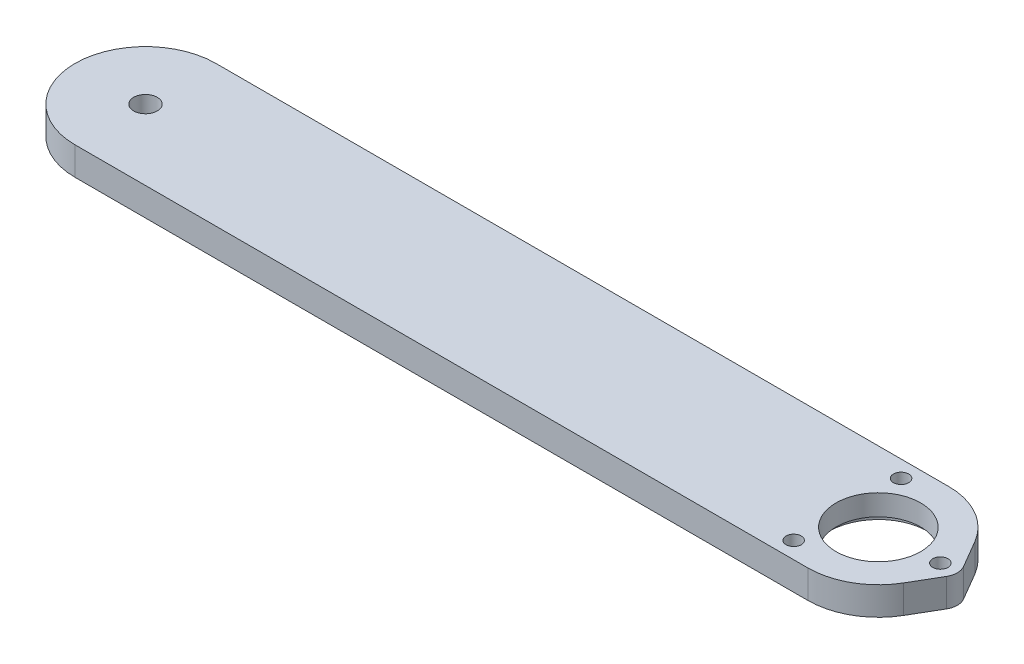
ISO-10303-21;
HEADER;
FILE_DESCRIPTION(('STEP AP214'),'2;1');
FILE_NAME('part.step','',(''),(''),'','','');
FILE_SCHEMA(('AUTOMOTIVE_DESIGN { 1 0 10303 214 1 1 1 1 }'));
ENDSEC;
DATA;
#1=APPLICATION_CONTEXT('core data for automotive mechanical design processes');
#2=APPLICATION_PROTOCOL_DEFINITION('international standard','automotive_design',2000,#1);
#3=PRODUCT_CONTEXT('',#1,'mechanical');
#4=PRODUCT('Part','Part','',(#3));
#5=PRODUCT_RELATED_PRODUCT_CATEGORY('part','',(#4));
#6=PRODUCT_DEFINITION_FORMATION('','',#4);
#7=PRODUCT_DEFINITION_CONTEXT('part definition',#1,'design');
#8=PRODUCT_DEFINITION('design','',#6,#7);
#9=PRODUCT_DEFINITION_SHAPE('','',#8);
#10=(LENGTH_UNIT() NAMED_UNIT(*) SI_UNIT(.MILLI.,.METRE.));
#11=(NAMED_UNIT(*) PLANE_ANGLE_UNIT() SI_UNIT($,.RADIAN.));
#12=(NAMED_UNIT(*) SI_UNIT($,.STERADIAN.) SOLID_ANGLE_UNIT());
#13=UNCERTAINTY_MEASURE_WITH_UNIT(LENGTH_MEASURE(1.E-05),#10,'distance_accuracy_value','');
#14=(GEOMETRIC_REPRESENTATION_CONTEXT(3) GLOBAL_UNCERTAINTY_ASSIGNED_CONTEXT((#13)) GLOBAL_UNIT_ASSIGNED_CONTEXT((#10,
#11,#12)) REPRESENTATION_CONTEXT('',''));
#15=CARTESIAN_POINT('',(0.,0.,0.));
#16=DIRECTION('',(0.,0.,1.));
#17=DIRECTION('',(1.,0.,0.));
#18=AXIS2_PLACEMENT_3D('',#15,#16,#17);
#19=CARTESIAN_POINT('',(65.,5.,0.));
#20=DIRECTION('',(0.,-1.,0.));
#21=DIRECTION('',(0.,0.,-1.));
#22=AXIS2_PLACEMENT_3D('',#19,#20,#21);
#23=CYLINDRICAL_SURFACE('',#22,12.5);
#24=CARTESIAN_POINT('',(65.,5.,0.));
#25=DIRECTION('',(0.,1.,0.));
#26=DIRECTION('',(0.,0.,1.));
#27=AXIS2_PLACEMENT_3D('',#24,#25,#26);
#28=CIRCLE('',#27,12.5);
#29=CARTESIAN_POINT('',(75.7954545454546,5.,-6.30144119682354));
#30=VERTEX_POINT('',#29);
#31=CARTESIAN_POINT('',(65.,5.,-12.5));
#32=VERTEX_POINT('',#31);
#33=EDGE_CURVE('E163',#30,#32,#28,.T.);
#34=ORIENTED_EDGE('',*,*,#33,.F.);
#35=DIRECTION('',(0.,-1.,0.));
#36=VECTOR('',#35,1.);
#37=CARTESIAN_POINT('',(75.7954545454546,18.0039131109965,-6.30144119682354));
#38=LINE('',#37,#36);
#39=CARTESIAN_POINT('',(75.7954545454546,0.,-6.30144119682354));
#40=VERTEX_POINT('',#39);
#41=EDGE_CURVE('E134',#30,#40,#38,.T.);
#42=ORIENTED_EDGE('',*,*,#41,.T.);
#43=CARTESIAN_POINT('',(65.,0.,0.));
#44=DIRECTION('',(0.,1.,0.));
#45=DIRECTION('',(0.,0.,1.));
#46=AXIS2_PLACEMENT_3D('',#43,#44,#45);
#47=CIRCLE('',#46,12.5);
#48=CARTESIAN_POINT('',(65.,0.,-12.5));
#49=VERTEX_POINT('',#48);
#50=EDGE_CURVE('E176',#40,#49,#47,.T.);
#51=ORIENTED_EDGE('',*,*,#50,.T.);
#52=DIRECTION('',(0.,-1.,0.));
#53=VECTOR('',#52,1.);
#54=CARTESIAN_POINT('',(65.,5.,-12.5));
#55=LINE('',#54,#53);
#56=EDGE_CURVE('E184',#32,#49,#55,.T.);
#57=ORIENTED_EDGE('',*,*,#56,.F.);
#58=EDGE_LOOP('',(#34,#42,#51,#57));
#59=FACE_BOUND('',#58,.T.);
#60=ADVANCED_FACE('F38',(#59),#23,.T.);
#61=CARTESIAN_POINT('',(-65.,5.,0.));
#62=DIRECTION('',(0.,-1.,0.));
#63=DIRECTION('',(0.,0.,-1.));
#64=AXIS2_PLACEMENT_3D('',#61,#62,#63);
#65=CYLINDRICAL_SURFACE('',#64,12.5);
#66=CARTESIAN_POINT('',(-65.,0.,0.));
#67=DIRECTION('',(0.,1.,0.));
#68=DIRECTION('',(0.,0.,1.));
#69=AXIS2_PLACEMENT_3D('',#66,#67,#68);
#70=CIRCLE('',#69,12.5);
#71=CARTESIAN_POINT('',(-65.,0.,-12.5));
#72=VERTEX_POINT('',#71);
#73=CARTESIAN_POINT('',(-65.,0.,12.5));
#74=VERTEX_POINT('',#73);
#75=EDGE_CURVE('E157',#72,#74,#70,.T.);
#76=ORIENTED_EDGE('',*,*,#75,.T.);
#77=DIRECTION('',(0.,-1.,0.));
#78=VECTOR('',#77,1.);
#79=CARTESIAN_POINT('',(-65.,5.,12.5));
#80=LINE('',#79,#78);
#81=CARTESIAN_POINT('',(-65.,5.,12.5));
#82=VERTEX_POINT('',#81);
#83=EDGE_CURVE('E11',#82,#74,#80,.T.);
#84=ORIENTED_EDGE('',*,*,#83,.F.);
#85=CARTESIAN_POINT('',(-65.,5.,0.));
#86=DIRECTION('',(0.,1.,0.));
#87=DIRECTION('',(0.,0.,1.));
#88=AXIS2_PLACEMENT_3D('',#85,#86,#87);
#89=CIRCLE('',#88,12.5);
#90=CARTESIAN_POINT('',(-65.,5.,-12.5));
#91=VERTEX_POINT('',#90);
#92=EDGE_CURVE('E158',#91,#82,#89,.T.);
#93=ORIENTED_EDGE('',*,*,#92,.F.);
#94=DIRECTION('',(0.,-1.,0.));
#95=VECTOR('',#94,1.);
#96=CARTESIAN_POINT('',(-65.,5.,-12.5));
#97=LINE('',#96,#95);
#98=EDGE_CURVE('E169',#91,#72,#97,.T.);
#99=ORIENTED_EDGE('',*,*,#98,.T.);
#100=EDGE_LOOP('',(#76,#84,#93,#99));
#101=FACE_BOUND('',#100,.T.);
#102=ADVANCED_FACE('F40',(#101),#65,.T.);
#103=CARTESIAN_POINT('',(-65.,5.,12.5));
#104=DIRECTION('',(0.,0.,-1.));
#105=DIRECTION('',(-1.,0.,0.));
#106=AXIS2_PLACEMENT_3D('',#103,#104,#105);
#107=PLANE('',#106);
#108=DIRECTION('',(1.,0.,0.));
#109=VECTOR('',#108,1.);
#110=CARTESIAN_POINT('',(-65.,0.,12.5));
#111=LINE('',#110,#109);
#112=CARTESIAN_POINT('',(65.,0.,12.5));
#113=VERTEX_POINT('',#112);
#114=EDGE_CURVE('E173',#74,#113,#111,.T.);
#115=ORIENTED_EDGE('',*,*,#114,.T.);
#116=DIRECTION('',(0.,-1.,0.));
#117=VECTOR('',#116,1.);
#118=CARTESIAN_POINT('',(65.,5.,12.5));
#119=LINE('',#118,#117);
#120=CARTESIAN_POINT('',(65.,5.,12.5));
#121=VERTEX_POINT('',#120);
#122=EDGE_CURVE('E48',#121,#113,#119,.T.);
#123=ORIENTED_EDGE('',*,*,#122,.F.);
#124=DIRECTION('',(1.,0.,0.));
#125=VECTOR('',#124,1.);
#126=CARTESIAN_POINT('',(-65.,5.,12.5));
#127=LINE('',#126,#125);
#128=EDGE_CURVE('E92',#82,#121,#127,.T.);
#129=ORIENTED_EDGE('',*,*,#128,.F.);
#130=ORIENTED_EDGE('',*,*,#83,.T.);
#131=EDGE_LOOP('',(#115,#123,#129,#130));
#132=FACE_BOUND('',#131,.T.);
#133=ADVANCED_FACE('F203',(#132),#107,.F.);
#134=CARTESIAN_POINT('',(75.7954545454546,0.,6.30144119682354));
#135=VERTEX_POINT('',#134);
#136=EDGE_CURVE('E177',#113,#135,#47,.T.);
#137=ORIENTED_EDGE('',*,*,#136,.T.);
#138=DIRECTION('',(0.,-1.,0.));
#139=VECTOR('',#138,1.);
#140=CARTESIAN_POINT('',(75.7954545454546,18.0039131109965,6.30144119682354));
#141=LINE('',#140,#139);
#142=CARTESIAN_POINT('',(75.7954545454546,5.,6.30144119682352));
#143=VERTEX_POINT('',#142);
#144=EDGE_CURVE('E149',#143,#135,#141,.T.);
#145=ORIENTED_EDGE('',*,*,#144,.F.);
#146=EDGE_CURVE('E164',#121,#143,#28,.T.);
#147=ORIENTED_EDGE('',*,*,#146,.F.);
#148=ORIENTED_EDGE('',*,*,#122,.T.);
#149=EDGE_LOOP('',(#137,#145,#147,#148));
#150=FACE_BOUND('',#149,.T.);
#151=ADVANCED_FACE('F193',(#150),#23,.T.);
#152=CARTESIAN_POINT('',(-65.,5.,-12.5));
#153=DIRECTION('',(0.,0.,1.));
#154=DIRECTION('',(1.,0.,0.));
#155=AXIS2_PLACEMENT_3D('',#152,#153,#154);
#156=PLANE('',#155);
#157=DIRECTION('',(-1.,0.,0.));
#158=VECTOR('',#157,1.);
#159=CARTESIAN_POINT('',(-65.,0.,-12.5));
#160=LINE('',#159,#158);
#161=EDGE_CURVE('E85',#49,#72,#160,.T.);
#162=ORIENTED_EDGE('',*,*,#161,.T.);
#163=ORIENTED_EDGE('',*,*,#98,.F.);
#164=DIRECTION('',(-1.,0.,0.));
#165=VECTOR('',#164,1.);
#166=CARTESIAN_POINT('',(-65.,5.,-12.5));
#167=LINE('',#166,#165);
#168=EDGE_CURVE('E64',#32,#91,#167,.T.);
#169=ORIENTED_EDGE('',*,*,#168,.F.);
#170=ORIENTED_EDGE('',*,*,#56,.T.);
#171=EDGE_LOOP('',(#162,#163,#169,#170));
#172=FACE_BOUND('',#171,.T.);
#173=ADVANCED_FACE('F209',(#172),#156,.F.);
#174=CARTESIAN_POINT('',(-65.,5.,0.));
#175=DIRECTION('',(0.,1.,0.));
#176=DIRECTION('',(0.,0.,1.));
#177=AXIS2_PLACEMENT_3D('',#174,#175,#176);
#178=PLANE('',#177);
#179=CARTESIAN_POINT('',(-65.,5.,0.));
#180=DIRECTION('',(0.,1.,0.));
#181=DIRECTION('',(0.,0.,1.));
#182=AXIS2_PLACEMENT_3D('',#179,#180,#181);
#183=CIRCLE('',#182,2.1);
#184=CARTESIAN_POINT('',(-65.,5.,2.1));
#185=VERTEX_POINT('',#184);
#186=EDGE_CURVE('E262',#185,#185,#183,.T.);
#187=ORIENTED_EDGE('',*,*,#186,.F.);
#188=EDGE_LOOP('',(#187));
#189=FACE_BOUND('',#188,.T.);
#190=CARTESIAN_POINT('',(59.5,5.,9.52627944162884));
#191=DIRECTION('',(0.,1.,0.));
#192=DIRECTION('',(0.,0.,1.));
#193=AXIS2_PLACEMENT_3D('',#190,#191,#192);
#194=CIRCLE('',#193,1.35);
#195=CARTESIAN_POINT('',(59.5,5.,10.8762794416288));
#196=VERTEX_POINT('',#195);
#197=EDGE_CURVE('E281',#196,#196,#194,.F.);
#198=ORIENTED_EDGE('',*,*,#197,.T.);
#199=EDGE_LOOP('',(#198));
#200=FACE_BOUND('',#199,.T.);
#201=CARTESIAN_POINT('',(76.,5.,0.));
#202=DIRECTION('',(0.,1.,0.));
#203=DIRECTION('',(0.,0.,1.));
#204=AXIS2_PLACEMENT_3D('',#201,#202,#203);
#205=CIRCLE('',#204,1.34999999999999);
#206=CARTESIAN_POINT('',(76.,5.,1.34999999999997));
#207=VERTEX_POINT('',#206);
#208=EDGE_CURVE('E289',#207,#207,#205,.F.);
#209=ORIENTED_EDGE('',*,*,#208,.T.);
#210=EDGE_LOOP('',(#209));
#211=FACE_BOUND('',#210,.T.);
#212=CARTESIAN_POINT('',(59.5,5.,-9.52627944162882));
#213=DIRECTION('',(0.,1.,0.));
#214=DIRECTION('',(0.,0.,1.));
#215=AXIS2_PLACEMENT_3D('',#212,#213,#214);
#216=CIRCLE('',#215,1.35);
#217=CARTESIAN_POINT('',(59.5,5.,-8.17627944162882));
#218=VERTEX_POINT('',#217);
#219=EDGE_CURVE('E267',#218,#218,#216,.F.);
#220=ORIENTED_EDGE('',*,*,#219,.T.);
#221=EDGE_LOOP('',(#220));
#222=FACE_BOUND('',#221,.T.);
#223=CARTESIAN_POINT('',(65.,5.,0.));
#224=DIRECTION('',(0.,1.,0.));
#225=DIRECTION('',(0.,0.,1.));
#226=AXIS2_PLACEMENT_3D('',#223,#224,#225);
#227=CIRCLE('',#226,7.50000000000001);
#228=CARTESIAN_POINT('',(65.,5.,7.50000000000001));
#229=VERTEX_POINT('',#228);
#230=EDGE_CURVE('E302',#229,#229,#227,.T.);
#231=ORIENTED_EDGE('',*,*,#230,.F.);
#232=EDGE_LOOP('',(#231));
#233=FACE_BOUND('',#232,.T.);
#234=ORIENTED_EDGE('',*,*,#146,.T.);
#235=DIRECTION('',(-0.504115295745882,0.,0.863636363636364));
#236=VECTOR('',#235,1.);
#237=CARTESIAN_POINT('',(75.7954545454546,5.,6.30144119682354));
#238=LINE('',#237,#236);
#239=CARTESIAN_POINT('',(78.5909090909091,5.,1.51234588723765));
#240=VERTEX_POINT('',#239);
#241=EDGE_CURVE('E55',#240,#143,#238,.T.);
#242=ORIENTED_EDGE('',*,*,#241,.F.);
#243=CARTESIAN_POINT('',(76.,5.,0.));
#244=DIRECTION('',(0.,1.,0.));
#245=DIRECTION('',(0.,0.,1.));
#246=AXIS2_PLACEMENT_3D('',#243,#244,#245);
#247=CIRCLE('',#246,3.);
#248=CARTESIAN_POINT('',(78.5909090909091,5.,-1.51234588723765));
#249=VERTEX_POINT('',#248);
#250=EDGE_CURVE('E112',#249,#240,#247,.F.);
#251=ORIENTED_EDGE('',*,*,#250,.F.);
#252=DIRECTION('',(0.504115295745882,0.,0.863636363636364));
#253=VECTOR('',#252,1.);
#254=CARTESIAN_POINT('',(75.7954545454546,5.,-6.30144119682354));
#255=LINE('',#254,#253);
#256=EDGE_CURVE('E117',#30,#249,#255,.T.);
#257=ORIENTED_EDGE('',*,*,#256,.F.);
#258=ORIENTED_EDGE('',*,*,#33,.T.);
#259=ORIENTED_EDGE('',*,*,#168,.T.);
#260=ORIENTED_EDGE('',*,*,#92,.T.);
#261=ORIENTED_EDGE('',*,*,#128,.T.);
#262=EDGE_LOOP('',(#234,#242,#251,#257,#258,#259,#260,#261));
#263=FACE_BOUND('',#262,.T.);
#264=ADVANCED_FACE('F115',(#189,#200,#211,#222,#233,#263),#178,.T.);
#265=CARTESIAN_POINT('',(-65.,0.,0.));
#266=DIRECTION('',(0.,1.,0.));
#267=DIRECTION('',(0.,0.,1.));
#268=AXIS2_PLACEMENT_3D('',#265,#266,#267);
#269=PLANE('',#268);
#270=CARTESIAN_POINT('',(-65.,0.,0.));
#271=DIRECTION('',(0.,1.,0.));
#272=DIRECTION('',(0.,0.,1.));
#273=AXIS2_PLACEMENT_3D('',#270,#271,#272);
#274=CIRCLE('',#273,2.1);
#275=CARTESIAN_POINT('',(-65.,0.,2.1));
#276=VERTEX_POINT('',#275);
#277=EDGE_CURVE('E265',#276,#276,#274,.F.);
#278=ORIENTED_EDGE('',*,*,#277,.F.);
#279=EDGE_LOOP('',(#278));
#280=FACE_BOUND('',#279,.T.);
#281=CARTESIAN_POINT('',(59.5,0.,9.52627944162884));
#282=DIRECTION('',(0.,-1.,0.));
#283=DIRECTION('',(0.,0.,-1.));
#284=AXIS2_PLACEMENT_3D('',#281,#282,#283);
#285=CIRCLE('',#284,1.35);
#286=CARTESIAN_POINT('',(59.5,0.,8.17627944162884));
#287=VERTEX_POINT('',#286);
#288=EDGE_CURVE('E276',#287,#287,#285,.T.);
#289=ORIENTED_EDGE('',*,*,#288,.F.);
#290=EDGE_LOOP('',(#289));
#291=FACE_BOUND('',#290,.T.);
#292=CARTESIAN_POINT('',(76.,0.,0.));
#293=DIRECTION('',(0.,-1.,0.));
#294=DIRECTION('',(0.,0.,-1.));
#295=AXIS2_PLACEMENT_3D('',#292,#293,#294);
#296=CIRCLE('',#295,1.34999999999999);
#297=CARTESIAN_POINT('',(76.,0.,-1.35000000000001));
#298=VERTEX_POINT('',#297);
#299=EDGE_CURVE('E285',#298,#298,#296,.T.);
#300=ORIENTED_EDGE('',*,*,#299,.F.);
#301=EDGE_LOOP('',(#300));
#302=FACE_BOUND('',#301,.T.);
#303=CARTESIAN_POINT('',(59.5,0.,-9.52627944162882));
#304=DIRECTION('',(0.,-1.,0.));
#305=DIRECTION('',(0.,0.,-1.));
#306=AXIS2_PLACEMENT_3D('',#303,#304,#305);
#307=CIRCLE('',#306,1.35);
#308=CARTESIAN_POINT('',(59.5,0.,-10.8762794416288));
#309=VERTEX_POINT('',#308);
#310=EDGE_CURVE('E271',#309,#309,#307,.T.);
#311=ORIENTED_EDGE('',*,*,#310,.F.);
#312=EDGE_LOOP('',(#311));
#313=FACE_BOUND('',#312,.T.);
#314=CARTESIAN_POINT('',(65.,0.,0.));
#315=DIRECTION('',(0.,1.,0.));
#316=DIRECTION('',(0.,0.,1.));
#317=AXIS2_PLACEMENT_3D('',#314,#315,#316);
#318=CIRCLE('',#317,8.75000000000001);
#319=CARTESIAN_POINT('',(65.,0.,8.75000000000001));
#320=VERTEX_POINT('',#319);
#321=EDGE_CURVE('E280',#320,#320,#318,.T.);
#322=ORIENTED_EDGE('',*,*,#321,.T.);
#323=EDGE_LOOP('',(#322));
#324=FACE_BOUND('',#323,.T.);
#325=ORIENTED_EDGE('',*,*,#50,.F.);
#326=DIRECTION('',(0.504115295745882,0.,0.863636363636364));
#327=VECTOR('',#326,1.);
#328=CARTESIAN_POINT('',(75.7954545454546,0.,-6.30144119682354));
#329=LINE('',#328,#327);
#330=CARTESIAN_POINT('',(78.5909090909091,0.,-1.51234588723765));
#331=VERTEX_POINT('',#330);
#332=EDGE_CURVE('E146',#40,#331,#329,.T.);
#333=ORIENTED_EDGE('',*,*,#332,.T.);
#334=CARTESIAN_POINT('',(76.,0.,0.));
#335=DIRECTION('',(0.,-1.,0.));
#336=DIRECTION('',(0.,0.,-1.));
#337=AXIS2_PLACEMENT_3D('',#334,#335,#336);
#338=CIRCLE('',#337,3.);
#339=CARTESIAN_POINT('',(78.5909090909091,0.,1.51234588723765));
#340=VERTEX_POINT('',#339);
#341=EDGE_CURVE('E127',#331,#340,#338,.T.);
#342=ORIENTED_EDGE('',*,*,#341,.T.);
#343=DIRECTION('',(-0.504115295745881,0.,0.863636363636364));
#344=VECTOR('',#343,1.);
#345=CARTESIAN_POINT('',(75.7954545454546,0.,6.30144119682354));
#346=LINE('',#345,#344);
#347=EDGE_CURVE('E137',#340,#135,#346,.T.);
#348=ORIENTED_EDGE('',*,*,#347,.T.);
#349=ORIENTED_EDGE('',*,*,#136,.F.);
#350=ORIENTED_EDGE('',*,*,#114,.F.);
#351=ORIENTED_EDGE('',*,*,#75,.F.);
#352=ORIENTED_EDGE('',*,*,#161,.F.);
#353=EDGE_LOOP('',(#325,#333,#342,#348,#349,#350,#351,#352));
#354=FACE_BOUND('',#353,.T.);
#355=ADVANCED_FACE('F196',(#280,#291,#302,#313,#324,#354),#269,.F.);
#356=CARTESIAN_POINT('',(75.7954545454546,18.0039131109965,-6.30144119682354));
#357=DIRECTION('',(0.863636363636364,0.,-0.504115295745882));
#358=DIRECTION('',(-0.504115295745882,0.,-0.863636363636364));
#359=AXIS2_PLACEMENT_3D('',#356,#357,#358);
#360=PLANE('',#359);
#361=ORIENTED_EDGE('',*,*,#41,.F.);
#362=ORIENTED_EDGE('',*,*,#256,.T.);
#363=DIRECTION('',(0.,-1.,0.));
#364=VECTOR('',#363,1.);
#365=CARTESIAN_POINT('',(78.5909090909091,18.0039131109965,-1.51234588723765));
#366=LINE('',#365,#364);
#367=EDGE_CURVE('E122',#249,#331,#366,.T.);
#368=ORIENTED_EDGE('',*,*,#367,.T.);
#369=ORIENTED_EDGE('',*,*,#332,.F.);
#370=EDGE_LOOP('',(#361,#362,#368,#369));
#371=FACE_BOUND('',#370,.T.);
#372=ADVANCED_FACE('F132',(#371),#360,.T.);
#373=CARTESIAN_POINT('',(76.,18.0039131109965,0.));
#374=DIRECTION('',(0.,-1.,0.));
#375=DIRECTION('',(0.,0.,-1.));
#376=AXIS2_PLACEMENT_3D('',#373,#374,#375);
#377=CYLINDRICAL_SURFACE('',#376,3.);
#378=ORIENTED_EDGE('',*,*,#367,.F.);
#379=ORIENTED_EDGE('',*,*,#250,.T.);
#380=DIRECTION('',(0.,-1.,0.));
#381=VECTOR('',#380,1.);
#382=CARTESIAN_POINT('',(78.5909090909091,18.0039131109965,1.51234588723765));
#383=LINE('',#382,#381);
#384=EDGE_CURVE('E121',#240,#340,#383,.T.);
#385=ORIENTED_EDGE('',*,*,#384,.T.);
#386=ORIENTED_EDGE('',*,*,#341,.F.);
#387=EDGE_LOOP('',(#378,#379,#385,#386));
#388=FACE_BOUND('',#387,.T.);
#389=ADVANCED_FACE('F125',(#388),#377,.T.);
#390=CARTESIAN_POINT('',(75.7954545454546,18.0039131109965,6.30144119682354));
#391=DIRECTION('',(0.863636363636364,0.,0.504115295745882));
#392=DIRECTION('',(0.504115295745882,0.,-0.863636363636364));
#393=AXIS2_PLACEMENT_3D('',#390,#391,#392);
#394=PLANE('',#393);
#395=ORIENTED_EDGE('',*,*,#384,.F.);
#396=ORIENTED_EDGE('',*,*,#241,.T.);
#397=ORIENTED_EDGE('',*,*,#144,.T.);
#398=ORIENTED_EDGE('',*,*,#347,.F.);
#399=EDGE_LOOP('',(#395,#396,#397,#398));
#400=FACE_BOUND('',#399,.T.);
#401=ADVANCED_FACE('F199',(#400),#394,.T.);
#402=CARTESIAN_POINT('',(65.,-0.00100000000000013,0.));
#403=DIRECTION('',(0.,1.,0.));
#404=DIRECTION('',(0.,0.,1.));
#405=AXIS2_PLACEMENT_3D('',#402,#403,#404);
#406=CYLINDRICAL_SURFACE('',#405,7.50000000000001);
#407=CARTESIAN_POINT('',(65.,1.3,0.));
#408=DIRECTION('',(0.,1.,0.));
#409=DIRECTION('',(0.,0.,1.));
#410=AXIS2_PLACEMENT_3D('',#407,#408,#409);
#411=CIRCLE('',#410,7.50000000000001);
#412=CARTESIAN_POINT('',(65.,1.3,7.50000000000001));
#413=VERTEX_POINT('',#412);
#414=EDGE_CURVE('E42',#413,#413,#411,.F.);
#415=ORIENTED_EDGE('',*,*,#414,.T.);
#416=EDGE_LOOP('',(#415));
#417=FACE_BOUND('',#416,.T.);
#418=ORIENTED_EDGE('',*,*,#230,.T.);
#419=EDGE_LOOP('',(#418));
#420=FACE_BOUND('',#419,.T.);
#421=ADVANCED_FACE('F230',(#417,#420),#406,.F.);
#422=CARTESIAN_POINT('',(65.,1.3,0.));
#423=DIRECTION('',(0.,1.,0.));
#424=DIRECTION('',(0.,0.,1.));
#425=AXIS2_PLACEMENT_3D('',#422,#423,#424);
#426=PLANE('',#425);
#427=CARTESIAN_POINT('',(65.,1.3,0.));
#428=DIRECTION('',(0.,1.,0.));
#429=DIRECTION('',(0.,0.,1.));
#430=AXIS2_PLACEMENT_3D('',#427,#428,#429);
#431=CIRCLE('',#430,8.75000000000001);
#432=CARTESIAN_POINT('',(65.,1.3,8.75000000000001));
#433=VERTEX_POINT('',#432);
#434=EDGE_CURVE('E296',#433,#433,#431,.T.);
#435=ORIENTED_EDGE('',*,*,#434,.F.);
#436=EDGE_LOOP('',(#435));
#437=FACE_BOUND('',#436,.T.);
#438=ORIENTED_EDGE('',*,*,#414,.F.);
#439=EDGE_LOOP('',(#438));
#440=FACE_BOUND('',#439,.T.);
#441=ADVANCED_FACE('F233',(#437,#440),#426,.F.);
#442=CARTESIAN_POINT('',(65.,1.3,0.));
#443=DIRECTION('',(0.,-1.,0.));
#444=DIRECTION('',(0.,0.,-1.));
#445=AXIS2_PLACEMENT_3D('',#442,#443,#444);
#446=CYLINDRICAL_SURFACE('',#445,8.75000000000001);
#447=ORIENTED_EDGE('',*,*,#434,.T.);
#448=EDGE_LOOP('',(#447));
#449=FACE_BOUND('',#448,.T.);
#450=ORIENTED_EDGE('',*,*,#321,.F.);
#451=EDGE_LOOP('',(#450));
#452=FACE_BOUND('',#451,.T.);
#453=ADVANCED_FACE('F235',(#449,#452),#446,.F.);
#454=CARTESIAN_POINT('',(59.5,5.001,-9.52627944162882));
#455=DIRECTION('',(0.,-1.,0.));
#456=DIRECTION('',(0.,0.,-1.));
#457=AXIS2_PLACEMENT_3D('',#454,#455,#456);
#458=CYLINDRICAL_SURFACE('',#457,1.35);
#459=ORIENTED_EDGE('',*,*,#219,.F.);
#460=EDGE_LOOP('',(#459));
#461=FACE_BOUND('',#460,.T.);
#462=ORIENTED_EDGE('',*,*,#310,.T.);
#463=EDGE_LOOP('',(#462));
#464=FACE_BOUND('',#463,.T.);
#465=ADVANCED_FACE('F238',(#461,#464),#458,.F.);
#466=CARTESIAN_POINT('',(76.,5.001,0.));
#467=DIRECTION('',(0.,-1.,0.));
#468=DIRECTION('',(0.,0.,-1.));
#469=AXIS2_PLACEMENT_3D('',#466,#467,#468);
#470=CYLINDRICAL_SURFACE('',#469,1.34999999999999);
#471=ORIENTED_EDGE('',*,*,#208,.F.);
#472=EDGE_LOOP('',(#471));
#473=FACE_BOUND('',#472,.T.);
#474=ORIENTED_EDGE('',*,*,#299,.T.);
#475=EDGE_LOOP('',(#474));
#476=FACE_BOUND('',#475,.T.);
#477=ADVANCED_FACE('F245',(#473,#476),#470,.F.);
#478=CARTESIAN_POINT('',(59.5,5.001,9.52627944162884));
#479=DIRECTION('',(0.,-1.,0.));
#480=DIRECTION('',(0.,0.,-1.));
#481=AXIS2_PLACEMENT_3D('',#478,#479,#480);
#482=CYLINDRICAL_SURFACE('',#481,1.35);
#483=ORIENTED_EDGE('',*,*,#197,.F.);
#484=EDGE_LOOP('',(#483));
#485=FACE_BOUND('',#484,.T.);
#486=ORIENTED_EDGE('',*,*,#288,.T.);
#487=EDGE_LOOP('',(#486));
#488=FACE_BOUND('',#487,.T.);
#489=ADVANCED_FACE('F249',(#485,#488),#482,.F.);
#490=CARTESIAN_POINT('',(-65.,-0.00100000000000013,0.));
#491=DIRECTION('',(0.,1.,0.));
#492=DIRECTION('',(0.,0.,1.));
#493=AXIS2_PLACEMENT_3D('',#490,#491,#492);
#494=CYLINDRICAL_SURFACE('',#493,2.1);
#495=ORIENTED_EDGE('',*,*,#186,.T.);
#496=EDGE_LOOP('',(#495));
#497=FACE_BOUND('',#496,.T.);
#498=ORIENTED_EDGE('',*,*,#277,.T.);
#499=EDGE_LOOP('',(#498));
#500=FACE_BOUND('',#499,.T.);
#501=ADVANCED_FACE('F253',(#497,#500),#494,.F.);
#502=CLOSED_SHELL('',(#60,#102,#133,#151,#173,#264,#355,#372,#389,#401,#421,#441,#453,#465,#477,
#489,#501));
#503=MANIFOLD_SOLID_BREP('B2',#502);
#504=ADVANCED_BREP_SHAPE_REPRESENTATION('',(#18,#503),#14);
#505=SHAPE_DEFINITION_REPRESENTATION(#9,#504);
ENDSEC;
END-ISO-10303-21;
